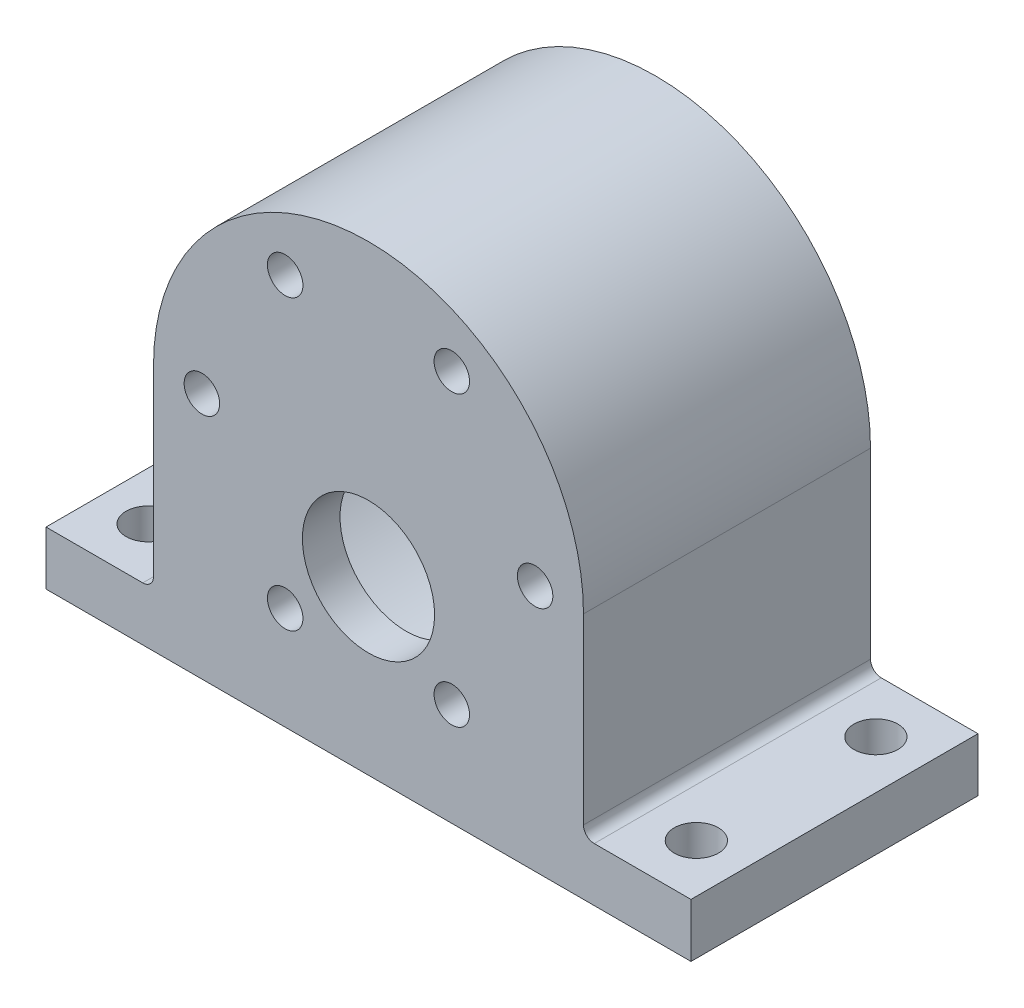
ISO-10303-21;
HEADER;
FILE_DESCRIPTION(('STEP AP214'),'2;1');
FILE_NAME('part.step','',(''),(''),'','','');
FILE_SCHEMA(('AUTOMOTIVE_DESIGN { 1 0 10303 214 1 1 1 1 }'));
ENDSEC;
DATA;
#1=APPLICATION_CONTEXT('core data for automotive mechanical design processes');
#2=APPLICATION_PROTOCOL_DEFINITION('international standard','automotive_design',2000,#1);
#3=PRODUCT_CONTEXT('',#1,'mechanical');
#4=PRODUCT('Part','Part','',(#3));
#5=PRODUCT_RELATED_PRODUCT_CATEGORY('part','',(#4));
#6=PRODUCT_DEFINITION_FORMATION('','',#4);
#7=PRODUCT_DEFINITION_CONTEXT('part definition',#1,'design');
#8=PRODUCT_DEFINITION('design','',#6,#7);
#9=PRODUCT_DEFINITION_SHAPE('','',#8);
#10=(LENGTH_UNIT() NAMED_UNIT(*) SI_UNIT(.MILLI.,.METRE.));
#11=(NAMED_UNIT(*) PLANE_ANGLE_UNIT() SI_UNIT($,.RADIAN.));
#12=(NAMED_UNIT(*) SI_UNIT($,.STERADIAN.) SOLID_ANGLE_UNIT());
#13=UNCERTAINTY_MEASURE_WITH_UNIT(LENGTH_MEASURE(1.E-05),#10,'distance_accuracy_value','');
#14=(GEOMETRIC_REPRESENTATION_CONTEXT(3) GLOBAL_UNCERTAINTY_ASSIGNED_CONTEXT((#13)) GLOBAL_UNIT_ASSIGNED_CONTEXT((#10,
#11,#12)) REPRESENTATION_CONTEXT('',''));
#15=CARTESIAN_POINT('',(0.,0.,0.));
#16=DIRECTION('',(0.,0.,1.));
#17=DIRECTION('',(1.,0.,0.));
#18=AXIS2_PLACEMENT_3D('',#15,#16,#17);
#19=CARTESIAN_POINT('',(21.,-18.,-3.5));
#20=DIRECTION('',(0.,1.,0.));
#21=DIRECTION('',(0.,0.,1.));
#22=AXIS2_PLACEMENT_3D('',#19,#20,#21);
#23=PLANE('',#22);
#24=DIRECTION('',(-1.,0.,0.));
#25=VECTOR('',#24,1.);
#26=CARTESIAN_POINT('',(21.,-18.,0.));
#27=LINE('',#26,#25);
#28=CARTESIAN_POINT('',(30.,-18.,0.));
#29=VERTEX_POINT('',#28);
#30=CARTESIAN_POINT('',(21.,-18.,0.));
#31=VERTEX_POINT('',#30);
#32=EDGE_CURVE('E217',#29,#31,#27,.T.);
#33=ORIENTED_EDGE('',*,*,#32,.F.);
#34=DIRECTION('',(0.,0.,1.));
#35=VECTOR('',#34,1.);
#36=CARTESIAN_POINT('',(30.,-18.,-3.5));
#37=LINE('',#36,#35);
#38=CARTESIAN_POINT('',(30.,-18.,-26.7));
#39=VERTEX_POINT('',#38);
#40=EDGE_CURVE('E228',#39,#29,#37,.T.);
#41=ORIENTED_EDGE('',*,*,#40,.F.);
#42=DIRECTION('',(1.,0.,0.));
#43=VECTOR('',#42,1.);
#44=CARTESIAN_POINT('',(21.,-18.,-26.7));
#45=LINE('',#44,#43);
#46=CARTESIAN_POINT('',(21.,-18.,-26.7));
#47=VERTEX_POINT('',#46);
#48=EDGE_CURVE('E138',#47,#39,#45,.T.);
#49=ORIENTED_EDGE('',*,*,#48,.F.);
#50=DIRECTION('',(0.,0.,1.));
#51=VECTOR('',#50,1.);
#52=CARTESIAN_POINT('',(21.,-18.,-3.5));
#53=LINE('',#52,#51);
#54=EDGE_CURVE('E226',#47,#31,#53,.T.);
#55=ORIENTED_EDGE('',*,*,#54,.T.);
#56=EDGE_LOOP('',(#33,#41,#49,#55));
#57=FACE_BOUND('',#56,.T.);
#58=CARTESIAN_POINT('',(25.5,-18.,-5.));
#59=DIRECTION('',(0.,1.,0.));
#60=DIRECTION('',(0.,0.,1.));
#61=AXIS2_PLACEMENT_3D('',#58,#59,#60);
#62=CIRCLE('',#61,2.05);
#63=CARTESIAN_POINT('',(25.5,-18.,-2.95));
#64=VERTEX_POINT('',#63);
#65=EDGE_CURVE('E250',#64,#64,#62,.T.);
#66=ORIENTED_EDGE('',*,*,#65,.F.);
#67=EDGE_LOOP('',(#66));
#68=FACE_BOUND('',#67,.T.);
#69=CARTESIAN_POINT('',(25.5,-18.,-21.7));
#70=DIRECTION('',(0.,1.,0.));
#71=DIRECTION('',(0.,0.,1.));
#72=AXIS2_PLACEMENT_3D('',#69,#70,#71);
#73=CIRCLE('',#72,2.05);
#74=CARTESIAN_POINT('',(25.5,-18.,-19.65));
#75=VERTEX_POINT('',#74);
#76=EDGE_CURVE('E261',#75,#75,#73,.F.);
#77=ORIENTED_EDGE('',*,*,#76,.T.);
#78=EDGE_LOOP('',(#77));
#79=FACE_BOUND('',#78,.T.);
#80=ADVANCED_FACE('F35',(#57,#68,#79),#23,.T.);
#81=CARTESIAN_POINT('',(30.,-23.,-3.5));
#82=DIRECTION('',(0.,-1.,0.));
#83=DIRECTION('',(0.,0.,-1.));
#84=AXIS2_PLACEMENT_3D('',#81,#82,#83);
#85=PLANE('',#84);
#86=CARTESIAN_POINT('',(25.5,-23.,-21.7));
#87=DIRECTION('',(0.,-1.,0.));
#88=DIRECTION('',(0.,0.,-1.));
#89=AXIS2_PLACEMENT_3D('',#86,#87,#88);
#90=CIRCLE('',#89,2.05);
#91=CARTESIAN_POINT('',(25.5,-23.,-23.75));
#92=VERTEX_POINT('',#91);
#93=EDGE_CURVE('E39',#92,#92,#90,.F.);
#94=ORIENTED_EDGE('',*,*,#93,.T.);
#95=EDGE_LOOP('',(#94));
#96=FACE_BOUND('',#95,.T.);
#97=CARTESIAN_POINT('',(25.5,-23.,-5.));
#98=DIRECTION('',(0.,-1.,0.));
#99=DIRECTION('',(0.,0.,-1.));
#100=AXIS2_PLACEMENT_3D('',#97,#98,#99);
#101=CIRCLE('',#100,2.05);
#102=CARTESIAN_POINT('',(25.5,-23.,-7.05));
#103=VERTEX_POINT('',#102);
#104=EDGE_CURVE('E248',#103,#103,#101,.T.);
#105=ORIENTED_EDGE('',*,*,#104,.F.);
#106=EDGE_LOOP('',(#105));
#107=FACE_BOUND('',#106,.T.);
#108=CARTESIAN_POINT('',(-25.5,-23.,-21.7));
#109=DIRECTION('',(0.,-1.,0.));
#110=DIRECTION('',(0.,0.,-1.));
#111=AXIS2_PLACEMENT_3D('',#108,#109,#110);
#112=CIRCLE('',#111,2.05);
#113=CARTESIAN_POINT('',(-25.5,-23.,-23.75));
#114=VERTEX_POINT('',#113);
#115=EDGE_CURVE('E244',#114,#114,#112,.T.);
#116=ORIENTED_EDGE('',*,*,#115,.F.);
#117=EDGE_LOOP('',(#116));
#118=FACE_BOUND('',#117,.T.);
#119=DIRECTION('',(1.,0.,0.));
#120=VECTOR('',#119,1.);
#121=CARTESIAN_POINT('',(30.,-23.,0.));
#122=LINE('',#121,#120);
#123=CARTESIAN_POINT('',(-30.,-23.,0.));
#124=VERTEX_POINT('',#123);
#125=CARTESIAN_POINT('',(30.,-23.,0.));
#126=VERTEX_POINT('',#125);
#127=EDGE_CURVE('E211',#124,#126,#122,.T.);
#128=ORIENTED_EDGE('',*,*,#127,.F.);
#129=DIRECTION('',(0.,0.,1.));
#130=VECTOR('',#129,1.);
#131=CARTESIAN_POINT('',(-30.,-23.,-3.5));
#132=LINE('',#131,#130);
#133=CARTESIAN_POINT('',(-30.,-23.,-26.7));
#134=VERTEX_POINT('',#133);
#135=EDGE_CURVE('E232',#134,#124,#132,.T.);
#136=ORIENTED_EDGE('',*,*,#135,.F.);
#137=DIRECTION('',(-1.,0.,0.));
#138=VECTOR('',#137,1.);
#139=CARTESIAN_POINT('',(30.,-23.,-26.7));
#140=LINE('',#139,#138);
#141=CARTESIAN_POINT('',(30.,-23.,-26.7));
#142=VERTEX_POINT('',#141);
#143=EDGE_CURVE('E144',#142,#134,#140,.T.);
#144=ORIENTED_EDGE('',*,*,#143,.F.);
#145=DIRECTION('',(0.,0.,1.));
#146=VECTOR('',#145,1.);
#147=CARTESIAN_POINT('',(30.,-23.,-3.5));
#148=LINE('',#147,#146);
#149=EDGE_CURVE('E230',#142,#126,#148,.T.);
#150=ORIENTED_EDGE('',*,*,#149,.T.);
#151=EDGE_LOOP('',(#128,#136,#144,#150));
#152=FACE_BOUND('',#151,.T.);
#153=CARTESIAN_POINT('',(-25.5,-23.,-5.));
#154=DIRECTION('',(0.,-1.,0.));
#155=DIRECTION('',(0.,0.,-1.));
#156=AXIS2_PLACEMENT_3D('',#153,#154,#155);
#157=CIRCLE('',#156,2.05);
#158=CARTESIAN_POINT('',(-25.5,-23.,-7.05));
#159=VERTEX_POINT('',#158);
#160=EDGE_CURVE('E247',#159,#159,#157,.F.);
#161=ORIENTED_EDGE('',*,*,#160,.T.);
#162=EDGE_LOOP('',(#161));
#163=FACE_BOUND('',#162,.T.);
#164=ADVANCED_FACE('F269',(#96,#107,#118,#152,#163),#85,.T.);
#165=CARTESIAN_POINT('',(-30.,-18.,-3.5));
#166=DIRECTION('',(0.,1.,0.));
#167=DIRECTION('',(0.,0.,1.));
#168=AXIS2_PLACEMENT_3D('',#165,#166,#167);
#169=PLANE('',#168);
#170=DIRECTION('',(-1.,0.,0.));
#171=VECTOR('',#170,1.);
#172=CARTESIAN_POINT('',(-30.,-18.,0.));
#173=LINE('',#172,#171);
#174=CARTESIAN_POINT('',(-21.,-18.,0.));
#175=VERTEX_POINT('',#174);
#176=CARTESIAN_POINT('',(-30.,-18.,0.));
#177=VERTEX_POINT('',#176);
#178=EDGE_CURVE('E205',#175,#177,#173,.T.);
#179=ORIENTED_EDGE('',*,*,#178,.F.);
#180=DIRECTION('',(0.,0.,1.));
#181=VECTOR('',#180,1.);
#182=CARTESIAN_POINT('',(-21.,-18.,-3.5));
#183=LINE('',#182,#181);
#184=CARTESIAN_POINT('',(-21.,-18.,-26.7));
#185=VERTEX_POINT('',#184);
#186=EDGE_CURVE('E236',#185,#175,#183,.T.);
#187=ORIENTED_EDGE('',*,*,#186,.F.);
#188=DIRECTION('',(1.,0.,0.));
#189=VECTOR('',#188,1.);
#190=CARTESIAN_POINT('',(-30.,-18.,-26.7));
#191=LINE('',#190,#189);
#192=CARTESIAN_POINT('',(-30.,-18.,-26.7));
#193=VERTEX_POINT('',#192);
#194=EDGE_CURVE('E150',#193,#185,#191,.T.);
#195=ORIENTED_EDGE('',*,*,#194,.F.);
#196=DIRECTION('',(0.,0.,1.));
#197=VECTOR('',#196,1.);
#198=CARTESIAN_POINT('',(-30.,-18.,-3.5));
#199=LINE('',#198,#197);
#200=EDGE_CURVE('E234',#193,#177,#199,.T.);
#201=ORIENTED_EDGE('',*,*,#200,.T.);
#202=EDGE_LOOP('',(#179,#187,#195,#201));
#203=FACE_BOUND('',#202,.T.);
#204=CARTESIAN_POINT('',(-25.5,-18.,-21.7));
#205=DIRECTION('',(0.,1.,0.));
#206=DIRECTION('',(0.,0.,1.));
#207=AXIS2_PLACEMENT_3D('',#204,#205,#206);
#208=CIRCLE('',#207,2.05);
#209=CARTESIAN_POINT('',(-25.5,-18.,-19.65));
#210=VERTEX_POINT('',#209);
#211=EDGE_CURVE('E241',#210,#210,#208,.T.);
#212=ORIENTED_EDGE('',*,*,#211,.F.);
#213=EDGE_LOOP('',(#212));
#214=FACE_BOUND('',#213,.T.);
#215=CARTESIAN_POINT('',(-25.5,-18.,-5.));
#216=DIRECTION('',(0.,1.,0.));
#217=DIRECTION('',(0.,0.,1.));
#218=AXIS2_PLACEMENT_3D('',#215,#216,#217);
#219=CIRCLE('',#218,2.05);
#220=CARTESIAN_POINT('',(-25.5,-18.,-2.95));
#221=VERTEX_POINT('',#220);
#222=EDGE_CURVE('E245',#221,#221,#219,.F.);
#223=ORIENTED_EDGE('',*,*,#222,.T.);
#224=EDGE_LOOP('',(#223));
#225=FACE_BOUND('',#224,.T.);
#226=ADVANCED_FACE('F291',(#203,#214,#225),#169,.T.);
#227=CARTESIAN_POINT('',(0.,0.,-3.5));
#228=DIRECTION('',(0.,0.,-1.));
#229=DIRECTION('',(-1.,0.,0.));
#230=AXIS2_PLACEMENT_3D('',#227,#228,#229);
#231=PLANE('',#230);
#232=CARTESIAN_POINT('',(0.,-7.,-3.5));
#233=DIRECTION('',(0.,0.,1.));
#234=DIRECTION('',(1.,0.,0.));
#235=AXIS2_PLACEMENT_3D('',#232,#233,#234);
#236=CIRCLE('',#235,6.15);
#237=CARTESIAN_POINT('',(6.15,-7.,-3.5));
#238=VERTEX_POINT('',#237);
#239=EDGE_CURVE('E193',#238,#238,#236,.T.);
#240=ORIENTED_EDGE('',*,*,#239,.T.);
#241=EDGE_LOOP('',(#240));
#242=FACE_BOUND('',#241,.T.);
#243=CARTESIAN_POINT('',(-15.5,0.,-3.5));
#244=DIRECTION('',(0.,0.,1.));
#245=DIRECTION('',(1.,0.,0.));
#246=AXIS2_PLACEMENT_3D('',#243,#244,#245);
#247=CIRCLE('',#246,1.65);
#248=CARTESIAN_POINT('',(-13.85,0.,-3.5));
#249=VERTEX_POINT('',#248);
#250=EDGE_CURVE('E187',#249,#249,#247,.T.);
#251=ORIENTED_EDGE('',*,*,#250,.T.);
#252=EDGE_LOOP('',(#251));
#253=FACE_BOUND('',#252,.T.);
#254=CARTESIAN_POINT('',(-7.75000000000001,13.4233937586588,-3.5));
#255=DIRECTION('',(0.,0.,1.));
#256=DIRECTION('',(1.,0.,0.));
#257=AXIS2_PLACEMENT_3D('',#254,#255,#256);
#258=CIRCLE('',#257,1.65);
#259=CARTESIAN_POINT('',(-6.10000000000001,13.4233937586588,-3.5));
#260=VERTEX_POINT('',#259);
#261=EDGE_CURVE('E181',#260,#260,#258,.T.);
#262=ORIENTED_EDGE('',*,*,#261,.T.);
#263=EDGE_LOOP('',(#262));
#264=FACE_BOUND('',#263,.T.);
#265=CARTESIAN_POINT('',(7.74999999999999,13.4233937586588,-3.5));
#266=DIRECTION('',(0.,0.,1.));
#267=DIRECTION('',(1.,0.,0.));
#268=AXIS2_PLACEMENT_3D('',#265,#266,#267);
#269=CIRCLE('',#268,1.65);
#270=CARTESIAN_POINT('',(9.4,13.4233937586588,-3.5));
#271=VERTEX_POINT('',#270);
#272=EDGE_CURVE('E175',#271,#271,#269,.T.);
#273=ORIENTED_EDGE('',*,*,#272,.T.);
#274=EDGE_LOOP('',(#273));
#275=FACE_BOUND('',#274,.T.);
#276=CARTESIAN_POINT('',(15.5,0.,-3.5));
#277=DIRECTION('',(0.,0.,1.));
#278=DIRECTION('',(1.,0.,0.));
#279=AXIS2_PLACEMENT_3D('',#276,#277,#278);
#280=CIRCLE('',#279,1.65);
#281=CARTESIAN_POINT('',(17.15,0.,-3.5));
#282=VERTEX_POINT('',#281);
#283=EDGE_CURVE('E169',#282,#282,#280,.T.);
#284=ORIENTED_EDGE('',*,*,#283,.T.);
#285=EDGE_LOOP('',(#284));
#286=FACE_BOUND('',#285,.T.);
#287=CARTESIAN_POINT('',(7.75000000000001,-13.4233937586588,-3.5));
#288=DIRECTION('',(0.,0.,1.));
#289=DIRECTION('',(1.,0.,0.));
#290=AXIS2_PLACEMENT_3D('',#287,#288,#289);
#291=CIRCLE('',#290,1.65);
#292=CARTESIAN_POINT('',(9.40000000000001,-13.4233937586588,-3.5));
#293=VERTEX_POINT('',#292);
#294=EDGE_CURVE('E163',#293,#293,#291,.T.);
#295=ORIENTED_EDGE('',*,*,#294,.T.);
#296=EDGE_LOOP('',(#295));
#297=FACE_BOUND('',#296,.T.);
#298=CARTESIAN_POINT('',(-7.74999999999999,-13.4233937586588,-3.5));
#299=DIRECTION('',(0.,0.,1.));
#300=DIRECTION('',(1.,0.,0.));
#301=AXIS2_PLACEMENT_3D('',#298,#299,#300);
#302=CIRCLE('',#301,1.65);
#303=CARTESIAN_POINT('',(-6.09999999999999,-13.4233937586588,-3.5));
#304=VERTEX_POINT('',#303);
#305=EDGE_CURVE('E157',#304,#304,#302,.T.);
#306=ORIENTED_EDGE('',*,*,#305,.T.);
#307=EDGE_LOOP('',(#306));
#308=FACE_BOUND('',#307,.T.);
#309=CARTESIAN_POINT('',(0.,0.,-3.5));
#310=DIRECTION('',(0.,0.,-1.));
#311=DIRECTION('',(-1.,0.,0.));
#312=AXIS2_PLACEMENT_3D('',#309,#310,#311);
#313=CIRCLE('',#312,18.65);
#314=CARTESIAN_POINT('',(-18.65,0.,-3.5));
#315=VERTEX_POINT('',#314);
#316=EDGE_CURVE('E133',#315,#315,#313,.T.);
#317=ORIENTED_EDGE('',*,*,#316,.T.);
#318=EDGE_LOOP('',(#317));
#319=FACE_BOUND('',#318,.T.);
#320=ADVANCED_FACE('F310',(#242,#253,#264,#275,#286,#297,#308,#319),#231,.T.);
#321=CARTESIAN_POINT('',(0.,0.,-3.5));
#322=DIRECTION('',(0.,0.,1.));
#323=DIRECTION('',(1.,0.,0.));
#324=AXIS2_PLACEMENT_3D('',#321,#322,#323);
#325=CYLINDRICAL_SURFACE('',#324,20.);
#326=CARTESIAN_POINT('',(0.,0.,0.));
#327=DIRECTION('',(0.,0.,1.));
#328=DIRECTION('',(-1.,0.,0.));
#329=AXIS2_PLACEMENT_3D('',#326,#327,#328);
#330=CIRCLE('',#329,20.);
#331=CARTESIAN_POINT('',(20.,0.,0.));
#332=VERTEX_POINT('',#331);
#333=CARTESIAN_POINT('',(-20.,0.,0.));
#334=VERTEX_POINT('',#333);
#335=EDGE_CURVE('E115',#332,#334,#330,.T.);
#336=ORIENTED_EDGE('',*,*,#335,.F.);
#337=DIRECTION('',(0.,0.,1.));
#338=VECTOR('',#337,1.);
#339=CARTESIAN_POINT('',(20.,0.,-3.5));
#340=LINE('',#339,#338);
#341=CARTESIAN_POINT('',(20.,0.,-26.7));
#342=VERTEX_POINT('',#341);
#343=EDGE_CURVE('E11',#342,#332,#340,.T.);
#344=ORIENTED_EDGE('',*,*,#343,.F.);
#345=CARTESIAN_POINT('',(0.,0.,-26.7));
#346=DIRECTION('',(0.,0.,-1.));
#347=DIRECTION('',(-1.,0.,0.));
#348=AXIS2_PLACEMENT_3D('',#345,#346,#347);
#349=CIRCLE('',#348,20.);
#350=CARTESIAN_POINT('',(-20.,0.,-26.7));
#351=VERTEX_POINT('',#350);
#352=EDGE_CURVE('E113',#351,#342,#349,.T.);
#353=ORIENTED_EDGE('',*,*,#352,.F.);
#354=DIRECTION('',(0.,0.,1.));
#355=VECTOR('',#354,1.);
#356=CARTESIAN_POINT('',(-20.,0.,-3.5));
#357=LINE('',#356,#355);
#358=EDGE_CURVE('E223',#351,#334,#357,.T.);
#359=ORIENTED_EDGE('',*,*,#358,.T.);
#360=EDGE_LOOP('',(#336,#344,#353,#359));
#361=FACE_BOUND('',#360,.T.);
#362=ADVANCED_FACE('F37',(#361),#325,.T.);
#363=CARTESIAN_POINT('',(20.,0.,-3.5));
#364=DIRECTION('',(1.,0.,0.));
#365=DIRECTION('',(0.,1.,0.));
#366=AXIS2_PLACEMENT_3D('',#363,#364,#365);
#367=PLANE('',#366);
#368=DIRECTION('',(0.,1.,0.));
#369=VECTOR('',#368,1.);
#370=CARTESIAN_POINT('',(20.,0.,0.));
#371=LINE('',#370,#369);
#372=CARTESIAN_POINT('',(20.,-17.,0.));
#373=VERTEX_POINT('',#372);
#374=EDGE_CURVE('E222',#373,#332,#371,.T.);
#375=ORIENTED_EDGE('',*,*,#374,.F.);
#376=DIRECTION('',(0.,0.,1.));
#377=VECTOR('',#376,1.);
#378=CARTESIAN_POINT('',(20.,-17.,-3.5));
#379=LINE('',#378,#377);
#380=CARTESIAN_POINT('',(20.,-17.,-26.7));
#381=VERTEX_POINT('',#380);
#382=EDGE_CURVE('E44',#381,#373,#379,.T.);
#383=ORIENTED_EDGE('',*,*,#382,.F.);
#384=DIRECTION('',(0.,-1.,0.));
#385=VECTOR('',#384,1.);
#386=CARTESIAN_POINT('',(20.,0.,-26.7));
#387=LINE('',#386,#385);
#388=EDGE_CURVE('E118',#342,#381,#387,.T.);
#389=ORIENTED_EDGE('',*,*,#388,.F.);
#390=ORIENTED_EDGE('',*,*,#343,.T.);
#391=EDGE_LOOP('',(#375,#383,#389,#390));
#392=FACE_BOUND('',#391,.T.);
#393=ADVANCED_FACE('F119',(#392),#367,.T.);
#394=CARTESIAN_POINT('',(21.,-17.,-3.5));
#395=DIRECTION('',(0.,0.,1.));
#396=DIRECTION('',(1.,0.,0.));
#397=AXIS2_PLACEMENT_3D('',#394,#395,#396);
#398=CYLINDRICAL_SURFACE('',#397,1.);
#399=CARTESIAN_POINT('',(21.,-17.,0.));
#400=DIRECTION('',(0.,0.,-1.));
#401=DIRECTION('',(1.,0.,0.));
#402=AXIS2_PLACEMENT_3D('',#399,#400,#401);
#403=CIRCLE('',#402,1.);
#404=EDGE_CURVE('E220',#31,#373,#403,.T.);
#405=ORIENTED_EDGE('',*,*,#404,.F.);
#406=ORIENTED_EDGE('',*,*,#54,.F.);
#407=CARTESIAN_POINT('',(21.,-17.,-26.7));
#408=DIRECTION('',(0.,0.,1.));
#409=DIRECTION('',(-1.,0.,0.));
#410=AXIS2_PLACEMENT_3D('',#407,#408,#409);
#411=CIRCLE('',#410,1.);
#412=EDGE_CURVE('E122',#381,#47,#411,.T.);
#413=ORIENTED_EDGE('',*,*,#412,.F.);
#414=ORIENTED_EDGE('',*,*,#382,.T.);
#415=EDGE_LOOP('',(#405,#406,#413,#414));
#416=FACE_BOUND('',#415,.T.);
#417=ADVANCED_FACE('F297',(#416),#398,.F.);
#418=CARTESIAN_POINT('',(30.,-18.,-3.5));
#419=DIRECTION('',(1.,0.,0.));
#420=DIRECTION('',(0.,0.,-1.));
#421=AXIS2_PLACEMENT_3D('',#418,#419,#420);
#422=PLANE('',#421);
#423=DIRECTION('',(0.,1.,0.));
#424=VECTOR('',#423,1.);
#425=CARTESIAN_POINT('',(30.,-18.,0.));
#426=LINE('',#425,#424);
#427=EDGE_CURVE('E214',#126,#29,#426,.T.);
#428=ORIENTED_EDGE('',*,*,#427,.F.);
#429=ORIENTED_EDGE('',*,*,#149,.F.);
#430=DIRECTION('',(0.,-1.,0.));
#431=VECTOR('',#430,1.);
#432=CARTESIAN_POINT('',(30.,-18.,-26.7));
#433=LINE('',#432,#431);
#434=EDGE_CURVE('E141',#39,#142,#433,.T.);
#435=ORIENTED_EDGE('',*,*,#434,.F.);
#436=ORIENTED_EDGE('',*,*,#40,.T.);
#437=EDGE_LOOP('',(#428,#429,#435,#436));
#438=FACE_BOUND('',#437,.T.);
#439=ADVANCED_FACE('F299',(#438),#422,.T.);
#440=CARTESIAN_POINT('',(-30.,-23.,-3.5));
#441=DIRECTION('',(-1.,0.,0.));
#442=DIRECTION('',(0.,0.,1.));
#443=AXIS2_PLACEMENT_3D('',#440,#441,#442);
#444=PLANE('',#443);
#445=DIRECTION('',(0.,-1.,0.));
#446=VECTOR('',#445,1.);
#447=CARTESIAN_POINT('',(-30.,-23.,0.));
#448=LINE('',#447,#446);
#449=EDGE_CURVE('E208',#177,#124,#448,.T.);
#450=ORIENTED_EDGE('',*,*,#449,.F.);
#451=ORIENTED_EDGE('',*,*,#200,.F.);
#452=DIRECTION('',(0.,1.,0.));
#453=VECTOR('',#452,1.);
#454=CARTESIAN_POINT('',(-30.,-23.,-26.7));
#455=LINE('',#454,#453);
#456=EDGE_CURVE('E147',#134,#193,#455,.T.);
#457=ORIENTED_EDGE('',*,*,#456,.F.);
#458=ORIENTED_EDGE('',*,*,#135,.T.);
#459=EDGE_LOOP('',(#450,#451,#457,#458));
#460=FACE_BOUND('',#459,.T.);
#461=ADVANCED_FACE('F301',(#460),#444,.T.);
#462=CARTESIAN_POINT('',(-21.,-17.,-3.5));
#463=DIRECTION('',(0.,0.,1.));
#464=DIRECTION('',(1.,0.,0.));
#465=AXIS2_PLACEMENT_3D('',#462,#463,#464);
#466=CYLINDRICAL_SURFACE('',#465,1.);
#467=CARTESIAN_POINT('',(-21.,-17.,0.));
#468=DIRECTION('',(0.,0.,-1.));
#469=DIRECTION('',(-1.,0.,0.));
#470=AXIS2_PLACEMENT_3D('',#467,#468,#469);
#471=CIRCLE('',#470,1.);
#472=CARTESIAN_POINT('',(-20.,-17.,0.));
#473=VERTEX_POINT('',#472);
#474=EDGE_CURVE('E202',#473,#175,#471,.T.);
#475=ORIENTED_EDGE('',*,*,#474,.F.);
#476=DIRECTION('',(0.,0.,1.));
#477=VECTOR('',#476,1.);
#478=CARTESIAN_POINT('',(-20.,-17.,-3.5));
#479=LINE('',#478,#477);
#480=CARTESIAN_POINT('',(-20.,-17.,-26.7));
#481=VERTEX_POINT('',#480);
#482=EDGE_CURVE('E238',#481,#473,#479,.T.);
#483=ORIENTED_EDGE('',*,*,#482,.F.);
#484=CARTESIAN_POINT('',(-21.,-17.,-26.7));
#485=DIRECTION('',(0.,0.,1.));
#486=DIRECTION('',(-1.,0.,0.));
#487=AXIS2_PLACEMENT_3D('',#484,#485,#486);
#488=CIRCLE('',#487,1.);
#489=EDGE_CURVE('E153',#185,#481,#488,.T.);
#490=ORIENTED_EDGE('',*,*,#489,.F.);
#491=ORIENTED_EDGE('',*,*,#186,.T.);
#492=EDGE_LOOP('',(#475,#483,#490,#491));
#493=FACE_BOUND('',#492,.T.);
#494=ADVANCED_FACE('F306',(#493),#466,.F.);
#495=CARTESIAN_POINT('',(-20.,0.,-3.5));
#496=DIRECTION('',(-1.,0.,0.));
#497=DIRECTION('',(0.,0.,1.));
#498=AXIS2_PLACEMENT_3D('',#495,#496,#497);
#499=PLANE('',#498);
#500=DIRECTION('',(0.,-1.,0.));
#501=VECTOR('',#500,1.);
#502=CARTESIAN_POINT('',(-20.,0.,0.));
#503=LINE('',#502,#501);
#504=EDGE_CURVE('E199',#334,#473,#503,.T.);
#505=ORIENTED_EDGE('',*,*,#504,.F.);
#506=ORIENTED_EDGE('',*,*,#358,.F.);
#507=DIRECTION('',(0.,1.,0.));
#508=VECTOR('',#507,1.);
#509=CARTESIAN_POINT('',(-20.,-17.,-26.7));
#510=LINE('',#509,#508);
#511=EDGE_CURVE('E129',#481,#351,#510,.T.);
#512=ORIENTED_EDGE('',*,*,#511,.F.);
#513=ORIENTED_EDGE('',*,*,#482,.T.);
#514=EDGE_LOOP('',(#505,#506,#512,#513));
#515=FACE_BOUND('',#514,.T.);
#516=ADVANCED_FACE('F313',(#515),#499,.T.);
#517=CARTESIAN_POINT('',(0.,0.,0.));
#518=DIRECTION('',(0.,0.,-1.));
#519=DIRECTION('',(-1.,0.,0.));
#520=AXIS2_PLACEMENT_3D('',#517,#518,#519);
#521=PLANE('',#520);
#522=CARTESIAN_POINT('',(-7.74999999999999,-13.4233937586588,0.));
#523=DIRECTION('',(0.,0.,1.));
#524=DIRECTION('',(1.,0.,0.));
#525=AXIS2_PLACEMENT_3D('',#522,#523,#524);
#526=CIRCLE('',#525,1.65);
#527=CARTESIAN_POINT('',(-6.09999999999999,-13.4233937586588,0.));
#528=VERTEX_POINT('',#527);
#529=EDGE_CURVE('E156',#528,#528,#526,.T.);
#530=ORIENTED_EDGE('',*,*,#529,.F.);
#531=EDGE_LOOP('',(#530));
#532=FACE_BOUND('',#531,.T.);
#533=CARTESIAN_POINT('',(7.75000000000001,-13.4233937586588,0.));
#534=DIRECTION('',(0.,0.,1.));
#535=DIRECTION('',(1.,0.,0.));
#536=AXIS2_PLACEMENT_3D('',#533,#534,#535);
#537=CIRCLE('',#536,1.65);
#538=CARTESIAN_POINT('',(9.40000000000001,-13.4233937586588,0.));
#539=VERTEX_POINT('',#538);
#540=EDGE_CURVE('E160',#539,#539,#537,.T.);
#541=ORIENTED_EDGE('',*,*,#540,.F.);
#542=EDGE_LOOP('',(#541));
#543=FACE_BOUND('',#542,.T.);
#544=CARTESIAN_POINT('',(15.5,0.,0.));
#545=DIRECTION('',(0.,0.,1.));
#546=DIRECTION('',(1.,0.,0.));
#547=AXIS2_PLACEMENT_3D('',#544,#545,#546);
#548=CIRCLE('',#547,1.65);
#549=CARTESIAN_POINT('',(17.15,0.,0.));
#550=VERTEX_POINT('',#549);
#551=EDGE_CURVE('E166',#550,#550,#548,.T.);
#552=ORIENTED_EDGE('',*,*,#551,.F.);
#553=EDGE_LOOP('',(#552));
#554=FACE_BOUND('',#553,.T.);
#555=CARTESIAN_POINT('',(7.74999999999999,13.4233937586588,0.));
#556=DIRECTION('',(0.,0.,1.));
#557=DIRECTION('',(1.,0.,0.));
#558=AXIS2_PLACEMENT_3D('',#555,#556,#557);
#559=CIRCLE('',#558,1.65);
#560=CARTESIAN_POINT('',(9.4,13.4233937586588,0.));
#561=VERTEX_POINT('',#560);
#562=EDGE_CURVE('E172',#561,#561,#559,.T.);
#563=ORIENTED_EDGE('',*,*,#562,.F.);
#564=EDGE_LOOP('',(#563));
#565=FACE_BOUND('',#564,.T.);
#566=CARTESIAN_POINT('',(-7.75000000000001,13.4233937586588,0.));
#567=DIRECTION('',(0.,0.,1.));
#568=DIRECTION('',(1.,0.,0.));
#569=AXIS2_PLACEMENT_3D('',#566,#567,#568);
#570=CIRCLE('',#569,1.65);
#571=CARTESIAN_POINT('',(-6.10000000000001,13.4233937586588,0.));
#572=VERTEX_POINT('',#571);
#573=EDGE_CURVE('E178',#572,#572,#570,.T.);
#574=ORIENTED_EDGE('',*,*,#573,.F.);
#575=EDGE_LOOP('',(#574));
#576=FACE_BOUND('',#575,.T.);
#577=CARTESIAN_POINT('',(-15.5,0.,0.));
#578=DIRECTION('',(0.,0.,1.));
#579=DIRECTION('',(1.,0.,0.));
#580=AXIS2_PLACEMENT_3D('',#577,#578,#579);
#581=CIRCLE('',#580,1.65);
#582=CARTESIAN_POINT('',(-13.85,0.,0.));
#583=VERTEX_POINT('',#582);
#584=EDGE_CURVE('E184',#583,#583,#581,.T.);
#585=ORIENTED_EDGE('',*,*,#584,.F.);
#586=EDGE_LOOP('',(#585));
#587=FACE_BOUND('',#586,.T.);
#588=CARTESIAN_POINT('',(0.,-7.,0.));
#589=DIRECTION('',(0.,0.,1.));
#590=DIRECTION('',(1.,0.,0.));
#591=AXIS2_PLACEMENT_3D('',#588,#589,#590);
#592=CIRCLE('',#591,6.15);
#593=CARTESIAN_POINT('',(6.15,-7.,0.));
#594=VERTEX_POINT('',#593);
#595=EDGE_CURVE('E190',#594,#594,#592,.T.);
#596=ORIENTED_EDGE('',*,*,#595,.F.);
#597=EDGE_LOOP('',(#596));
#598=FACE_BOUND('',#597,.T.);
#599=ORIENTED_EDGE('',*,*,#335,.T.);
#600=ORIENTED_EDGE('',*,*,#504,.T.);
#601=ORIENTED_EDGE('',*,*,#474,.T.);
#602=ORIENTED_EDGE('',*,*,#178,.T.);
#603=ORIENTED_EDGE('',*,*,#449,.T.);
#604=ORIENTED_EDGE('',*,*,#127,.T.);
#605=ORIENTED_EDGE('',*,*,#427,.T.);
#606=ORIENTED_EDGE('',*,*,#32,.T.);
#607=ORIENTED_EDGE('',*,*,#404,.T.);
#608=ORIENTED_EDGE('',*,*,#374,.T.);
#609=EDGE_LOOP('',(#599,#600,#601,#602,#603,#604,#605,#606,#607,#608));
#610=FACE_BOUND('',#609,.T.);
#611=ADVANCED_FACE('F316',(#532,#543,#554,#565,#576,#587,#598,#610),#521,.F.);
#612=CARTESIAN_POINT('',(0.,-7.,-3.5));
#613=DIRECTION('',(0.,0.,1.));
#614=DIRECTION('',(1.,0.,0.));
#615=AXIS2_PLACEMENT_3D('',#612,#613,#614);
#616=CYLINDRICAL_SURFACE('',#615,6.15);
#617=ORIENTED_EDGE('',*,*,#239,.F.);
#618=EDGE_LOOP('',(#617));
#619=FACE_BOUND('',#618,.T.);
#620=ORIENTED_EDGE('',*,*,#595,.T.);
#621=EDGE_LOOP('',(#620));
#622=FACE_BOUND('',#621,.T.);
#623=ADVANCED_FACE('F321',(#619,#622),#616,.F.);
#624=CARTESIAN_POINT('',(-15.5,0.,-3.5));
#625=DIRECTION('',(0.,0.,1.));
#626=DIRECTION('',(1.,0.,0.));
#627=AXIS2_PLACEMENT_3D('',#624,#625,#626);
#628=CYLINDRICAL_SURFACE('',#627,1.65);
#629=ORIENTED_EDGE('',*,*,#250,.F.);
#630=EDGE_LOOP('',(#629));
#631=FACE_BOUND('',#630,.T.);
#632=ORIENTED_EDGE('',*,*,#584,.T.);
#633=EDGE_LOOP('',(#632));
#634=FACE_BOUND('',#633,.T.);
#635=ADVANCED_FACE('F380',(#631,#634),#628,.F.);
#636=CARTESIAN_POINT('',(-7.75000000000001,13.4233937586588,-3.5));
#637=DIRECTION('',(0.,0.,1.));
#638=DIRECTION('',(1.,0.,0.));
#639=AXIS2_PLACEMENT_3D('',#636,#637,#638);
#640=CYLINDRICAL_SURFACE('',#639,1.65);
#641=ORIENTED_EDGE('',*,*,#261,.F.);
#642=EDGE_LOOP('',(#641));
#643=FACE_BOUND('',#642,.T.);
#644=ORIENTED_EDGE('',*,*,#573,.T.);
#645=EDGE_LOOP('',(#644));
#646=FACE_BOUND('',#645,.T.);
#647=ADVANCED_FACE('F376',(#643,#646),#640,.F.);
#648=CARTESIAN_POINT('',(7.74999999999999,13.4233937586588,-3.5));
#649=DIRECTION('',(0.,0.,1.));
#650=DIRECTION('',(1.,0.,0.));
#651=AXIS2_PLACEMENT_3D('',#648,#649,#650);
#652=CYLINDRICAL_SURFACE('',#651,1.65);
#653=ORIENTED_EDGE('',*,*,#272,.F.);
#654=EDGE_LOOP('',(#653));
#655=FACE_BOUND('',#654,.T.);
#656=ORIENTED_EDGE('',*,*,#562,.T.);
#657=EDGE_LOOP('',(#656));
#658=FACE_BOUND('',#657,.T.);
#659=ADVANCED_FACE('F372',(#655,#658),#652,.F.);
#660=CARTESIAN_POINT('',(15.5,0.,-3.5));
#661=DIRECTION('',(0.,0.,1.));
#662=DIRECTION('',(1.,0.,0.));
#663=AXIS2_PLACEMENT_3D('',#660,#661,#662);
#664=CYLINDRICAL_SURFACE('',#663,1.65);
#665=ORIENTED_EDGE('',*,*,#283,.F.);
#666=EDGE_LOOP('',(#665));
#667=FACE_BOUND('',#666,.T.);
#668=ORIENTED_EDGE('',*,*,#551,.T.);
#669=EDGE_LOOP('',(#668));
#670=FACE_BOUND('',#669,.T.);
#671=ADVANCED_FACE('F368',(#667,#670),#664,.F.);
#672=CARTESIAN_POINT('',(7.75000000000001,-13.4233937586588,-3.5));
#673=DIRECTION('',(0.,0.,1.));
#674=DIRECTION('',(1.,0.,0.));
#675=AXIS2_PLACEMENT_3D('',#672,#673,#674);
#676=CYLINDRICAL_SURFACE('',#675,1.65);
#677=ORIENTED_EDGE('',*,*,#294,.F.);
#678=EDGE_LOOP('',(#677));
#679=FACE_BOUND('',#678,.T.);
#680=ORIENTED_EDGE('',*,*,#540,.T.);
#681=EDGE_LOOP('',(#680));
#682=FACE_BOUND('',#681,.T.);
#683=ADVANCED_FACE('F364',(#679,#682),#676,.F.);
#684=CARTESIAN_POINT('',(-7.74999999999999,-13.4233937586588,-3.5));
#685=DIRECTION('',(0.,0.,1.));
#686=DIRECTION('',(1.,0.,0.));
#687=AXIS2_PLACEMENT_3D('',#684,#685,#686);
#688=CYLINDRICAL_SURFACE('',#687,1.65);
#689=ORIENTED_EDGE('',*,*,#305,.F.);
#690=EDGE_LOOP('',(#689));
#691=FACE_BOUND('',#690,.T.);
#692=ORIENTED_EDGE('',*,*,#529,.T.);
#693=EDGE_LOOP('',(#692));
#694=FACE_BOUND('',#693,.T.);
#695=ADVANCED_FACE('F361',(#691,#694),#688,.F.);
#696=CARTESIAN_POINT('',(0.,0.,-26.7));
#697=DIRECTION('',(0.,0.,-1.));
#698=DIRECTION('',(-1.,0.,0.));
#699=AXIS2_PLACEMENT_3D('',#696,#697,#698);
#700=PLANE('',#699);
#701=ORIENTED_EDGE('',*,*,#352,.T.);
#702=ORIENTED_EDGE('',*,*,#388,.T.);
#703=ORIENTED_EDGE('',*,*,#412,.T.);
#704=ORIENTED_EDGE('',*,*,#48,.T.);
#705=ORIENTED_EDGE('',*,*,#434,.T.);
#706=ORIENTED_EDGE('',*,*,#143,.T.);
#707=ORIENTED_EDGE('',*,*,#456,.T.);
#708=ORIENTED_EDGE('',*,*,#194,.T.);
#709=ORIENTED_EDGE('',*,*,#489,.T.);
#710=ORIENTED_EDGE('',*,*,#511,.T.);
#711=EDGE_LOOP('',(#701,#702,#703,#704,#705,#706,#707,#708,#709,#710));
#712=FACE_BOUND('',#711,.T.);
#713=CARTESIAN_POINT('',(0.,0.,-26.7));
#714=DIRECTION('',(0.,0.,-1.));
#715=DIRECTION('',(-1.,0.,0.));
#716=AXIS2_PLACEMENT_3D('',#713,#714,#715);
#717=CIRCLE('',#716,18.65);
#718=CARTESIAN_POINT('',(-18.65,0.,-26.7));
#719=VERTEX_POINT('',#718);
#720=EDGE_CURVE('E130',#719,#719,#717,.T.);
#721=ORIENTED_EDGE('',*,*,#720,.F.);
#722=EDGE_LOOP('',(#721));
#723=FACE_BOUND('',#722,.T.);
#724=ADVANCED_FACE('F125',(#712,#723),#700,.T.);
#725=CARTESIAN_POINT('',(0.,0.,-26.7));
#726=DIRECTION('',(0.,0.,1.));
#727=DIRECTION('',(1.,0.,0.));
#728=AXIS2_PLACEMENT_3D('',#725,#726,#727);
#729=CYLINDRICAL_SURFACE('',#728,18.65);
#730=ORIENTED_EDGE('',*,*,#720,.T.);
#731=EDGE_LOOP('',(#730));
#732=FACE_BOUND('',#731,.T.);
#733=ORIENTED_EDGE('',*,*,#316,.F.);
#734=EDGE_LOOP('',(#733));
#735=FACE_BOUND('',#734,.T.);
#736=ADVANCED_FACE('F349',(#732,#735),#729,.F.);
#737=CARTESIAN_POINT('',(-25.5,-31.,-21.7));
#738=DIRECTION('',(0.,1.,0.));
#739=DIRECTION('',(0.,0.,1.));
#740=AXIS2_PLACEMENT_3D('',#737,#738,#739);
#741=CYLINDRICAL_SURFACE('',#740,2.05);
#742=ORIENTED_EDGE('',*,*,#115,.T.);
#743=EDGE_LOOP('',(#742));
#744=FACE_BOUND('',#743,.T.);
#745=ORIENTED_EDGE('',*,*,#211,.T.);
#746=EDGE_LOOP('',(#745));
#747=FACE_BOUND('',#746,.T.);
#748=ADVANCED_FACE('F344',(#744,#747),#741,.F.);
#749=CARTESIAN_POINT('',(-25.5,-31.,-5.));
#750=DIRECTION('',(0.,1.,0.));
#751=DIRECTION('',(0.,0.,1.));
#752=AXIS2_PLACEMENT_3D('',#749,#750,#751);
#753=CYLINDRICAL_SURFACE('',#752,2.05);
#754=ORIENTED_EDGE('',*,*,#160,.F.);
#755=EDGE_LOOP('',(#754));
#756=FACE_BOUND('',#755,.T.);
#757=ORIENTED_EDGE('',*,*,#222,.F.);
#758=EDGE_LOOP('',(#757));
#759=FACE_BOUND('',#758,.T.);
#760=ADVANCED_FACE('F280',(#756,#759),#753,.F.);
#761=CARTESIAN_POINT('',(25.5,-31.,-5.));
#762=DIRECTION('',(0.,1.,0.));
#763=DIRECTION('',(0.,0.,1.));
#764=AXIS2_PLACEMENT_3D('',#761,#762,#763);
#765=CYLINDRICAL_SURFACE('',#764,2.05);
#766=ORIENTED_EDGE('',*,*,#65,.T.);
#767=EDGE_LOOP('',(#766));
#768=FACE_BOUND('',#767,.T.);
#769=ORIENTED_EDGE('',*,*,#104,.T.);
#770=EDGE_LOOP('',(#769));
#771=FACE_BOUND('',#770,.T.);
#772=ADVANCED_FACE('F274',(#768,#771),#765,.F.);
#773=CARTESIAN_POINT('',(25.5,-31.,-21.7));
#774=DIRECTION('',(0.,1.,0.));
#775=DIRECTION('',(0.,0.,1.));
#776=AXIS2_PLACEMENT_3D('',#773,#774,#775);
#777=CYLINDRICAL_SURFACE('',#776,2.05);
#778=ORIENTED_EDGE('',*,*,#76,.F.);
#779=EDGE_LOOP('',(#778));
#780=FACE_BOUND('',#779,.T.);
#781=ORIENTED_EDGE('',*,*,#93,.F.);
#782=EDGE_LOOP('',(#781));
#783=FACE_BOUND('',#782,.T.);
#784=ADVANCED_FACE('F272',(#780,#783),#777,.F.);
#785=CLOSED_SHELL('',(#80,#164,#226,#320,#362,#393,#417,#439,#461,#494,#516,#611,#623,#635,#647,
#659,#671,#683,#695,#724,#736,#748,#760,#772,#784));
#786=MANIFOLD_SOLID_BREP('B2',#785);
#787=ADVANCED_BREP_SHAPE_REPRESENTATION('',(#18,#786),#14);
#788=SHAPE_DEFINITION_REPRESENTATION(#9,#787);
ENDSEC;
END-ISO-10303-21;
